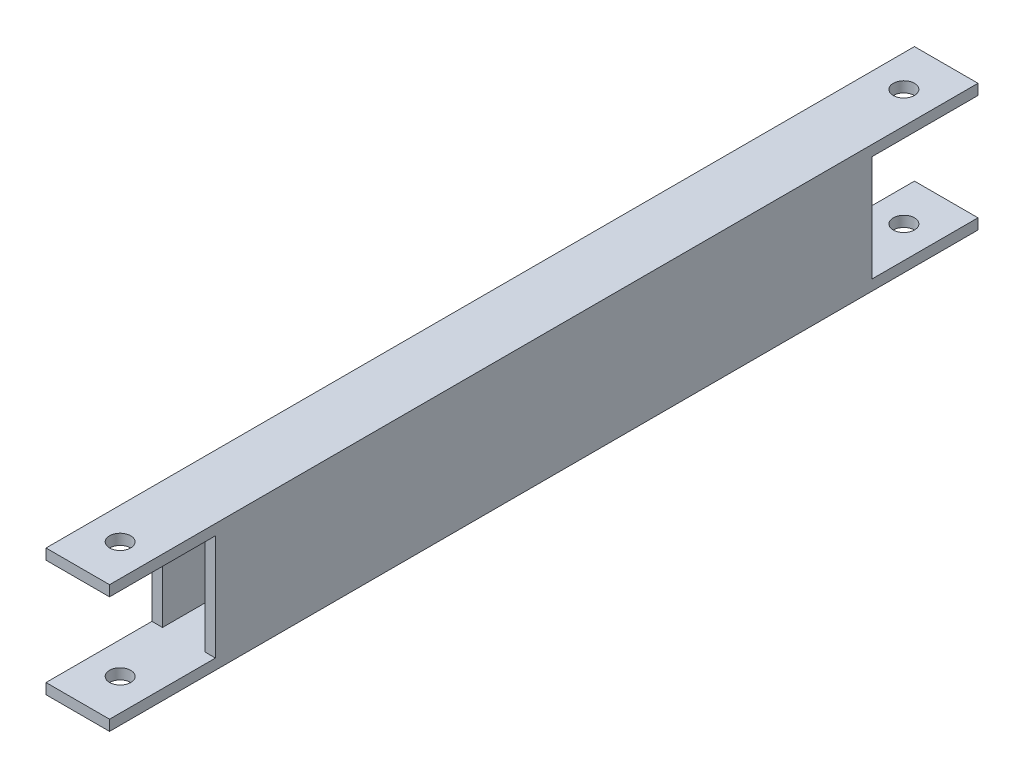
ISO-10303-21;
HEADER;
FILE_DESCRIPTION(('STEP AP214'),'2;1');
FILE_NAME('part.step','',(''),(''),'','','');
FILE_SCHEMA(('AUTOMOTIVE_DESIGN { 1 0 10303 214 1 1 1 1 }'));
ENDSEC;
DATA;
#1=APPLICATION_CONTEXT('core data for automotive mechanical design processes');
#2=APPLICATION_PROTOCOL_DEFINITION('international standard','automotive_design',2000,#1);
#3=PRODUCT_CONTEXT('',#1,'mechanical');
#4=PRODUCT('Part','Part','',(#3));
#5=PRODUCT_RELATED_PRODUCT_CATEGORY('part','',(#4));
#6=PRODUCT_DEFINITION_FORMATION('','',#4);
#7=PRODUCT_DEFINITION_CONTEXT('part definition',#1,'design');
#8=PRODUCT_DEFINITION('design','',#6,#7);
#9=PRODUCT_DEFINITION_SHAPE('','',#8);
#10=(LENGTH_UNIT() NAMED_UNIT(*) SI_UNIT(.MILLI.,.METRE.));
#11=(NAMED_UNIT(*) PLANE_ANGLE_UNIT() SI_UNIT($,.RADIAN.));
#12=(NAMED_UNIT(*) SI_UNIT($,.STERADIAN.) SOLID_ANGLE_UNIT());
#13=UNCERTAINTY_MEASURE_WITH_UNIT(LENGTH_MEASURE(1.E-05),#10,'distance_accuracy_value','');
#14=(GEOMETRIC_REPRESENTATION_CONTEXT(3) GLOBAL_UNCERTAINTY_ASSIGNED_CONTEXT((#13)) GLOBAL_UNIT_ASSIGNED_CONTEXT((#10,
#11,#12)) REPRESENTATION_CONTEXT('',''));
#15=CARTESIAN_POINT('',(0.,0.,0.));
#16=DIRECTION('',(0.,0.,1.));
#17=DIRECTION('',(1.,0.,0.));
#18=AXIS2_PLACEMENT_3D('',#15,#16,#17);
#19=CARTESIAN_POINT('',(15.875,3.175,260.35));
#20=DIRECTION('',(-1.,0.,0.));
#21=DIRECTION('',(0.,0.,1.));
#22=AXIS2_PLACEMENT_3D('',#19,#20,#21);
#23=PLANE('',#22);
#24=DIRECTION('',(0.,0.,-1.));
#25=VECTOR('',#24,1.);
#26=CARTESIAN_POINT('',(15.875,34.925,260.35));
#27=LINE('',#26,#25);
#28=CARTESIAN_POINT('',(15.875,34.925,228.6));
#29=VERTEX_POINT('',#28);
#30=CARTESIAN_POINT('',(15.875,34.925,31.75));
#31=VERTEX_POINT('',#30);
#32=EDGE_CURVE('E267',#29,#31,#27,.T.);
#33=ORIENTED_EDGE('',*,*,#32,.T.);
#34=DIRECTION('',(0.,-1.,0.));
#35=VECTOR('',#34,1.);
#36=CARTESIAN_POINT('',(15.875,3.175,31.75));
#37=LINE('',#36,#35);
#38=CARTESIAN_POINT('',(15.875,3.175,31.75));
#39=VERTEX_POINT('',#38);
#40=EDGE_CURVE('E202',#31,#39,#37,.T.);
#41=ORIENTED_EDGE('',*,*,#40,.T.);
#42=DIRECTION('',(0.,0.,-1.));
#43=VECTOR('',#42,1.);
#44=CARTESIAN_POINT('',(15.875,3.175,260.35));
#45=LINE('',#44,#43);
#46=CARTESIAN_POINT('',(15.875,3.175,228.6));
#47=VERTEX_POINT('',#46);
#48=EDGE_CURVE('E271',#47,#39,#45,.T.);
#49=ORIENTED_EDGE('',*,*,#48,.F.);
#50=DIRECTION('',(0.,1.,0.));
#51=VECTOR('',#50,1.);
#52=CARTESIAN_POINT('',(15.875,3.175,228.6));
#53=LINE('',#52,#51);
#54=EDGE_CURVE('E237',#47,#29,#53,.T.);
#55=ORIENTED_EDGE('',*,*,#54,.T.);
#56=EDGE_LOOP('',(#33,#41,#49,#55));
#57=FACE_BOUND('',#56,.T.);
#58=ADVANCED_FACE('F38',(#57),#23,.T.);
#59=CARTESIAN_POINT('',(3.175,3.175,260.35));
#60=DIRECTION('',(1.,0.,0.));
#61=DIRECTION('',(0.,0.,-1.));
#62=AXIS2_PLACEMENT_3D('',#59,#60,#61);
#63=PLANE('',#62);
#64=DIRECTION('',(0.,0.,-1.));
#65=VECTOR('',#64,1.);
#66=CARTESIAN_POINT('',(3.175,3.175,260.35));
#67=LINE('',#66,#65);
#68=CARTESIAN_POINT('',(3.175,3.175,228.6));
#69=VERTEX_POINT('',#68);
#70=CARTESIAN_POINT('',(3.175,3.175,31.75));
#71=VERTEX_POINT('',#70);
#72=EDGE_CURVE('E259',#69,#71,#67,.T.);
#73=ORIENTED_EDGE('',*,*,#72,.T.);
#74=DIRECTION('',(0.,1.,0.));
#75=VECTOR('',#74,1.);
#76=CARTESIAN_POINT('',(3.175,3.175,31.75));
#77=LINE('',#76,#75);
#78=CARTESIAN_POINT('',(3.175,34.925,31.75));
#79=VERTEX_POINT('',#78);
#80=EDGE_CURVE('E200',#71,#79,#77,.T.);
#81=ORIENTED_EDGE('',*,*,#80,.T.);
#82=DIRECTION('',(0.,0.,-1.));
#83=VECTOR('',#82,1.);
#84=CARTESIAN_POINT('',(3.175,34.925,260.35));
#85=LINE('',#84,#83);
#86=CARTESIAN_POINT('',(3.175,34.925,228.6));
#87=VERTEX_POINT('',#86);
#88=EDGE_CURVE('E177',#87,#79,#85,.T.);
#89=ORIENTED_EDGE('',*,*,#88,.F.);
#90=DIRECTION('',(0.,-1.,0.));
#91=VECTOR('',#90,1.);
#92=CARTESIAN_POINT('',(3.175,3.175,228.6));
#93=LINE('',#92,#91);
#94=EDGE_CURVE('E11',#87,#69,#93,.T.);
#95=ORIENTED_EDGE('',*,*,#94,.T.);
#96=EDGE_LOOP('',(#73,#81,#89,#95));
#97=FACE_BOUND('',#96,.T.);
#98=ADVANCED_FACE('F336',(#97),#63,.T.);
#99=CARTESIAN_POINT('',(0.,0.,0.));
#100=DIRECTION('',(0.,0.,-1.));
#101=DIRECTION('',(-1.,0.,0.));
#102=AXIS2_PLACEMENT_3D('',#99,#100,#101);
#103=PLANE('',#102);
#104=DIRECTION('',(0.,-1.,0.));
#105=VECTOR('',#104,1.);
#106=CARTESIAN_POINT('',(0.,0.,0.));
#107=LINE('',#106,#105);
#108=CARTESIAN_POINT('',(0.,3.175,0.));
#109=VERTEX_POINT('',#108);
#110=CARTESIAN_POINT('',(0.,0.,0.));
#111=VERTEX_POINT('',#110);
#112=EDGE_CURVE('E275',#109,#111,#107,.T.);
#113=ORIENTED_EDGE('',*,*,#112,.F.);
#114=DIRECTION('',(1.,0.,0.));
#115=VECTOR('',#114,1.);
#116=CARTESIAN_POINT('',(3.175,3.175,0.));
#117=LINE('',#116,#115);
#118=CARTESIAN_POINT('',(19.05,3.175,0.));
#119=VERTEX_POINT('',#118);
#120=EDGE_CURVE('E252',#109,#119,#117,.T.);
#121=ORIENTED_EDGE('',*,*,#120,.T.);
#122=DIRECTION('',(0.,1.,0.));
#123=VECTOR('',#122,1.);
#124=CARTESIAN_POINT('',(19.05,0.,0.));
#125=LINE('',#124,#123);
#126=CARTESIAN_POINT('',(19.05,0.,0.));
#127=VERTEX_POINT('',#126);
#128=EDGE_CURVE('E295',#127,#119,#125,.T.);
#129=ORIENTED_EDGE('',*,*,#128,.F.);
#130=DIRECTION('',(1.,0.,0.));
#131=VECTOR('',#130,1.);
#132=CARTESIAN_POINT('',(0.,0.,0.));
#133=LINE('',#132,#131);
#134=EDGE_CURVE('E292',#111,#127,#133,.T.);
#135=ORIENTED_EDGE('',*,*,#134,.F.);
#136=EDGE_LOOP('',(#113,#121,#129,#135));
#137=FACE_BOUND('',#136,.T.);
#138=ADVANCED_FACE('F341',(#137),#103,.T.);
#139=CARTESIAN_POINT('',(19.05,34.925,0.));
#140=VERTEX_POINT('',#139);
#141=CARTESIAN_POINT('',(19.05,38.1,0.));
#142=VERTEX_POINT('',#141);
#143=EDGE_CURVE('E294',#140,#142,#125,.T.);
#144=ORIENTED_EDGE('',*,*,#143,.F.);
#145=DIRECTION('',(-1.,0.,0.));
#146=VECTOR('',#145,1.);
#147=CARTESIAN_POINT('',(3.175,34.925,0.));
#148=LINE('',#147,#146);
#149=CARTESIAN_POINT('',(0.,34.925,0.));
#150=VERTEX_POINT('',#149);
#151=EDGE_CURVE('E257',#140,#150,#148,.T.);
#152=ORIENTED_EDGE('',*,*,#151,.T.);
#153=CARTESIAN_POINT('',(0.,38.1,0.));
#154=VERTEX_POINT('',#153);
#155=EDGE_CURVE('E190',#154,#150,#107,.T.);
#156=ORIENTED_EDGE('',*,*,#155,.F.);
#157=DIRECTION('',(-1.,0.,0.));
#158=VECTOR('',#157,1.);
#159=CARTESIAN_POINT('',(0.,38.1,0.));
#160=LINE('',#159,#158);
#161=EDGE_CURVE('E298',#142,#154,#160,.T.);
#162=ORIENTED_EDGE('',*,*,#161,.F.);
#163=EDGE_LOOP('',(#144,#152,#156,#162));
#164=FACE_BOUND('',#163,.T.);
#165=ADVANCED_FACE('F352',(#164),#103,.T.);
#166=CARTESIAN_POINT('',(0.,0.,260.35));
#167=DIRECTION('',(1.,0.,0.));
#168=DIRECTION('',(0.,0.,-1.));
#169=AXIS2_PLACEMENT_3D('',#166,#167,#168);
#170=PLANE('',#169);
#171=DIRECTION('',(0.,0.,-1.));
#172=VECTOR('',#171,1.);
#173=CARTESIAN_POINT('',(0.,3.175,31.75));
#174=LINE('',#173,#172);
#175=CARTESIAN_POINT('',(0.,3.175,31.75));
#176=VERTEX_POINT('',#175);
#177=EDGE_CURVE('E56',#176,#109,#174,.T.);
#178=ORIENTED_EDGE('',*,*,#177,.T.);
#179=ORIENTED_EDGE('',*,*,#112,.T.);
#180=DIRECTION('',(0.,0.,-1.));
#181=VECTOR('',#180,1.);
#182=CARTESIAN_POINT('',(0.,0.,260.35));
#183=LINE('',#182,#181);
#184=CARTESIAN_POINT('',(0.,0.,260.35));
#185=VERTEX_POINT('',#184);
#186=EDGE_CURVE('E48',#185,#111,#183,.T.);
#187=ORIENTED_EDGE('',*,*,#186,.F.);
#188=DIRECTION('',(0.,-1.,0.));
#189=VECTOR('',#188,1.);
#190=CARTESIAN_POINT('',(0.,0.,260.35));
#191=LINE('',#190,#189);
#192=CARTESIAN_POINT('',(0.,3.175,260.35));
#193=VERTEX_POINT('',#192);
#194=EDGE_CURVE('E280',#193,#185,#191,.T.);
#195=ORIENTED_EDGE('',*,*,#194,.F.);
#196=DIRECTION('',(0.,0.,1.));
#197=VECTOR('',#196,1.);
#198=CARTESIAN_POINT('',(0.,3.175,228.6));
#199=LINE('',#198,#197);
#200=CARTESIAN_POINT('',(0.,3.175,228.6));
#201=VERTEX_POINT('',#200);
#202=EDGE_CURVE('E232',#201,#193,#199,.T.);
#203=ORIENTED_EDGE('',*,*,#202,.F.);
#204=DIRECTION('',(0.,-1.,0.));
#205=VECTOR('',#204,1.);
#206=CARTESIAN_POINT('',(0.,34.925,228.6));
#207=LINE('',#206,#205);
#208=CARTESIAN_POINT('',(0.,34.925,228.6));
#209=VERTEX_POINT('',#208);
#210=EDGE_CURVE('E217',#209,#201,#207,.T.);
#211=ORIENTED_EDGE('',*,*,#210,.F.);
#212=DIRECTION('',(0.,0.,1.));
#213=VECTOR('',#212,1.);
#214=CARTESIAN_POINT('',(0.,34.925,228.6));
#215=LINE('',#214,#213);
#216=CARTESIAN_POINT('',(0.,34.925,260.35));
#217=VERTEX_POINT('',#216);
#218=EDGE_CURVE('E233',#209,#217,#215,.T.);
#219=ORIENTED_EDGE('',*,*,#218,.T.);
#220=CARTESIAN_POINT('',(0.,38.1,260.35));
#221=VERTEX_POINT('',#220);
#222=EDGE_CURVE('E276',#221,#217,#191,.T.);
#223=ORIENTED_EDGE('',*,*,#222,.F.);
#224=DIRECTION('',(0.,0.,-1.));
#225=VECTOR('',#224,1.);
#226=CARTESIAN_POINT('',(0.,38.1,260.35));
#227=LINE('',#226,#225);
#228=EDGE_CURVE('E290',#221,#154,#227,.T.);
#229=ORIENTED_EDGE('',*,*,#228,.T.);
#230=ORIENTED_EDGE('',*,*,#155,.T.);
#231=DIRECTION('',(0.,0.,-1.));
#232=VECTOR('',#231,1.);
#233=CARTESIAN_POINT('',(0.,34.925,31.75));
#234=LINE('',#233,#232);
#235=CARTESIAN_POINT('',(0.,34.925,31.75));
#236=VERTEX_POINT('',#235);
#237=EDGE_CURVE('E173',#236,#150,#234,.T.);
#238=ORIENTED_EDGE('',*,*,#237,.F.);
#239=DIRECTION('',(0.,-1.,0.));
#240=VECTOR('',#239,1.);
#241=CARTESIAN_POINT('',(0.,34.925,31.75));
#242=LINE('',#241,#240);
#243=EDGE_CURVE('E180',#236,#176,#242,.T.);
#244=ORIENTED_EDGE('',*,*,#243,.T.);
#245=EDGE_LOOP('',(#178,#179,#187,#195,#203,#211,#219,#223,#229,#230,#238,#244));
#246=FACE_BOUND('',#245,.T.);
#247=ADVANCED_FACE('F40',(#246),#170,.F.);
#248=CARTESIAN_POINT('',(19.05,0.,260.35));
#249=DIRECTION('',(-1.,0.,0.));
#250=DIRECTION('',(0.,0.,1.));
#251=AXIS2_PLACEMENT_3D('',#248,#249,#250);
#252=PLANE('',#251);
#253=DIRECTION('',(0.,0.,-1.));
#254=VECTOR('',#253,1.);
#255=CARTESIAN_POINT('',(19.05,3.175,31.75));
#256=LINE('',#255,#254);
#257=CARTESIAN_POINT('',(19.05,3.175,31.75));
#258=VERTEX_POINT('',#257);
#259=EDGE_CURVE('E194',#258,#119,#256,.T.);
#260=ORIENTED_EDGE('',*,*,#259,.F.);
#261=DIRECTION('',(0.,1.,0.));
#262=VECTOR('',#261,1.);
#263=CARTESIAN_POINT('',(19.05,34.925,31.75));
#264=LINE('',#263,#262);
#265=CARTESIAN_POINT('',(19.05,34.925,31.75));
#266=VERTEX_POINT('',#265);
#267=EDGE_CURVE('E383',#258,#266,#264,.T.);
#268=ORIENTED_EDGE('',*,*,#267,.T.);
#269=DIRECTION('',(0.,0.,-1.));
#270=VECTOR('',#269,1.);
#271=CARTESIAN_POINT('',(19.05,34.925,31.75));
#272=LINE('',#271,#270);
#273=EDGE_CURVE('E191',#266,#140,#272,.T.);
#274=ORIENTED_EDGE('',*,*,#273,.T.);
#275=ORIENTED_EDGE('',*,*,#143,.T.);
#276=DIRECTION('',(0.,0.,-1.));
#277=VECTOR('',#276,1.);
#278=CARTESIAN_POINT('',(19.05,38.1,260.35));
#279=LINE('',#278,#277);
#280=CARTESIAN_POINT('',(19.05,38.1,260.35));
#281=VERTEX_POINT('',#280);
#282=EDGE_CURVE('E302',#281,#142,#279,.T.);
#283=ORIENTED_EDGE('',*,*,#282,.F.);
#284=DIRECTION('',(0.,1.,0.));
#285=VECTOR('',#284,1.);
#286=CARTESIAN_POINT('',(19.05,0.,260.35));
#287=LINE('',#286,#285);
#288=CARTESIAN_POINT('',(19.05,34.925,260.35));
#289=VERTEX_POINT('',#288);
#290=EDGE_CURVE('E283',#289,#281,#287,.T.);
#291=ORIENTED_EDGE('',*,*,#290,.F.);
#292=DIRECTION('',(0.,0.,1.));
#293=VECTOR('',#292,1.);
#294=CARTESIAN_POINT('',(19.05,34.925,228.6));
#295=LINE('',#294,#293);
#296=CARTESIAN_POINT('',(19.05,34.925,228.6));
#297=VERTEX_POINT('',#296);
#298=EDGE_CURVE('E238',#297,#289,#295,.T.);
#299=ORIENTED_EDGE('',*,*,#298,.F.);
#300=DIRECTION('',(0.,1.,0.));
#301=VECTOR('',#300,1.);
#302=CARTESIAN_POINT('',(19.05,34.925,228.6));
#303=LINE('',#302,#301);
#304=CARTESIAN_POINT('',(19.05,3.175,228.6));
#305=VERTEX_POINT('',#304);
#306=EDGE_CURVE('E225',#305,#297,#303,.T.);
#307=ORIENTED_EDGE('',*,*,#306,.F.);
#308=DIRECTION('',(0.,0.,1.));
#309=VECTOR('',#308,1.);
#310=CARTESIAN_POINT('',(19.05,3.175,228.6));
#311=LINE('',#310,#309);
#312=CARTESIAN_POINT('',(19.05,3.175,260.35));
#313=VERTEX_POINT('',#312);
#314=EDGE_CURVE('E242',#305,#313,#311,.T.);
#315=ORIENTED_EDGE('',*,*,#314,.T.);
#316=CARTESIAN_POINT('',(19.05,0.,260.35));
#317=VERTEX_POINT('',#316);
#318=EDGE_CURVE('E284',#317,#313,#287,.T.);
#319=ORIENTED_EDGE('',*,*,#318,.F.);
#320=DIRECTION('',(0.,0.,-1.));
#321=VECTOR('',#320,1.);
#322=CARTESIAN_POINT('',(19.05,0.,260.35));
#323=LINE('',#322,#321);
#324=EDGE_CURVE('E306',#317,#127,#323,.T.);
#325=ORIENTED_EDGE('',*,*,#324,.T.);
#326=ORIENTED_EDGE('',*,*,#128,.T.);
#327=EDGE_LOOP('',(#260,#268,#274,#275,#283,#291,#299,#307,#315,#319,#325,#326));
#328=FACE_BOUND('',#327,.T.);
#329=ADVANCED_FACE('F357',(#328),#252,.F.);
#330=CARTESIAN_POINT('',(0.,0.,260.35));
#331=DIRECTION('',(0.,0.,-1.));
#332=DIRECTION('',(-1.,0.,0.));
#333=AXIS2_PLACEMENT_3D('',#330,#331,#332);
#334=PLANE('',#333);
#335=ORIENTED_EDGE('',*,*,#222,.T.);
#336=DIRECTION('',(-1.,0.,0.));
#337=VECTOR('',#336,1.);
#338=CARTESIAN_POINT('',(3.175,34.925,260.35));
#339=LINE('',#338,#337);
#340=EDGE_CURVE('E256',#289,#217,#339,.T.);
#341=ORIENTED_EDGE('',*,*,#340,.F.);
#342=ORIENTED_EDGE('',*,*,#290,.T.);
#343=DIRECTION('',(-1.,0.,0.));
#344=VECTOR('',#343,1.);
#345=CARTESIAN_POINT('',(0.,38.1,260.35));
#346=LINE('',#345,#344);
#347=EDGE_CURVE('E288',#281,#221,#346,.T.);
#348=ORIENTED_EDGE('',*,*,#347,.T.);
#349=EDGE_LOOP('',(#335,#341,#342,#348));
#350=FACE_BOUND('',#349,.T.);
#351=ADVANCED_FACE('F348',(#350),#334,.F.);
#352=ORIENTED_EDGE('',*,*,#318,.T.);
#353=DIRECTION('',(1.,0.,0.));
#354=VECTOR('',#353,1.);
#355=CARTESIAN_POINT('',(3.175,3.175,260.35));
#356=LINE('',#355,#354);
#357=EDGE_CURVE('E253',#193,#313,#356,.T.);
#358=ORIENTED_EDGE('',*,*,#357,.F.);
#359=ORIENTED_EDGE('',*,*,#194,.T.);
#360=DIRECTION('',(1.,0.,0.));
#361=VECTOR('',#360,1.);
#362=CARTESIAN_POINT('',(0.,0.,260.35));
#363=LINE('',#362,#361);
#364=EDGE_CURVE('E279',#185,#317,#363,.T.);
#365=ORIENTED_EDGE('',*,*,#364,.T.);
#366=EDGE_LOOP('',(#352,#358,#359,#365));
#367=FACE_BOUND('',#366,.T.);
#368=ADVANCED_FACE('F344',(#367),#334,.F.);
#369=CARTESIAN_POINT('',(0.,0.,260.35));
#370=DIRECTION('',(0.,1.,0.));
#371=DIRECTION('',(0.,0.,1.));
#372=AXIS2_PLACEMENT_3D('',#369,#370,#371);
#373=PLANE('',#372);
#374=CARTESIAN_POINT('',(9.52499999999997,0.,12.7));
#375=DIRECTION('',(0.,-1.,0.));
#376=DIRECTION('',(-1.,0.,0.));
#377=AXIS2_PLACEMENT_3D('',#374,#375,#376);
#378=CIRCLE('',#377,3.175);
#379=CARTESIAN_POINT('',(6.34999999999997,0.,12.7));
#380=VERTEX_POINT('',#379);
#381=EDGE_CURVE('E367',#380,#380,#378,.T.);
#382=ORIENTED_EDGE('',*,*,#381,.F.);
#383=EDGE_LOOP('',(#382));
#384=FACE_BOUND('',#383,.T.);
#385=CARTESIAN_POINT('',(9.52499999999997,0.,247.65));
#386=DIRECTION('',(0.,1.,0.));
#387=DIRECTION('',(-1.,0.,0.));
#388=AXIS2_PLACEMENT_3D('',#385,#386,#387);
#389=CIRCLE('',#388,3.175);
#390=CARTESIAN_POINT('',(6.34999999999997,0.,247.65));
#391=VERTEX_POINT('',#390);
#392=EDGE_CURVE('E206',#391,#391,#389,.T.);
#393=ORIENTED_EDGE('',*,*,#392,.T.);
#394=EDGE_LOOP('',(#393));
#395=FACE_BOUND('',#394,.T.);
#396=ORIENTED_EDGE('',*,*,#134,.T.);
#397=ORIENTED_EDGE('',*,*,#324,.F.);
#398=ORIENTED_EDGE('',*,*,#364,.F.);
#399=ORIENTED_EDGE('',*,*,#186,.T.);
#400=EDGE_LOOP('',(#396,#397,#398,#399));
#401=FACE_BOUND('',#400,.T.);
#402=ADVANCED_FACE('F347',(#384,#395,#401),#373,.F.);
#403=CARTESIAN_POINT('',(0.,38.1,260.35));
#404=DIRECTION('',(0.,-1.,0.));
#405=DIRECTION('',(1.,0.,0.));
#406=AXIS2_PLACEMENT_3D('',#403,#404,#405);
#407=PLANE('',#406);
#408=CARTESIAN_POINT('',(9.525,38.1,12.7));
#409=DIRECTION('',(0.,-1.,0.));
#410=DIRECTION('',(-1.,0.,0.));
#411=AXIS2_PLACEMENT_3D('',#408,#409,#410);
#412=CIRCLE('',#411,3.175);
#413=CARTESIAN_POINT('',(6.35,38.1,12.7));
#414=VERTEX_POINT('',#413);
#415=EDGE_CURVE('E387',#414,#414,#412,.T.);
#416=ORIENTED_EDGE('',*,*,#415,.T.);
#417=EDGE_LOOP('',(#416));
#418=FACE_BOUND('',#417,.T.);
#419=CARTESIAN_POINT('',(9.525,38.1,247.65));
#420=DIRECTION('',(0.,1.,0.));
#421=DIRECTION('',(-1.,0.,0.));
#422=AXIS2_PLACEMENT_3D('',#419,#420,#421);
#423=CIRCLE('',#422,3.175);
#424=CARTESIAN_POINT('',(6.35,38.1,247.65));
#425=VERTEX_POINT('',#424);
#426=EDGE_CURVE('E205',#425,#425,#423,.T.);
#427=ORIENTED_EDGE('',*,*,#426,.F.);
#428=EDGE_LOOP('',(#427));
#429=FACE_BOUND('',#428,.T.);
#430=ORIENTED_EDGE('',*,*,#161,.T.);
#431=ORIENTED_EDGE('',*,*,#228,.F.);
#432=ORIENTED_EDGE('',*,*,#347,.F.);
#433=ORIENTED_EDGE('',*,*,#282,.T.);
#434=EDGE_LOOP('',(#430,#431,#432,#433));
#435=FACE_BOUND('',#434,.T.);
#436=ADVANCED_FACE('F329',(#418,#429,#435),#407,.F.);
#437=CARTESIAN_POINT('',(3.175,3.175,260.35));
#438=DIRECTION('',(0.,1.,0.));
#439=DIRECTION('',(0.,0.,1.));
#440=AXIS2_PLACEMENT_3D('',#437,#438,#439);
#441=PLANE('',#440);
#442=CARTESIAN_POINT('',(9.52499999999997,3.175,12.7));
#443=DIRECTION('',(0.,1.,0.));
#444=DIRECTION('',(0.,0.,1.));
#445=AXIS2_PLACEMENT_3D('',#442,#443,#444);
#446=CIRCLE('',#445,3.175);
#447=CARTESIAN_POINT('',(9.52499999999997,3.175,15.875));
#448=VERTEX_POINT('',#447);
#449=EDGE_CURVE('E186',#448,#448,#446,.F.);
#450=ORIENTED_EDGE('',*,*,#449,.T.);
#451=EDGE_LOOP('',(#450));
#452=FACE_BOUND('',#451,.T.);
#453=ORIENTED_EDGE('',*,*,#120,.F.);
#454=ORIENTED_EDGE('',*,*,#177,.F.);
#455=DIRECTION('',(1.,0.,0.));
#456=VECTOR('',#455,1.);
#457=CARTESIAN_POINT('',(0.,3.175,31.75));
#458=LINE('',#457,#456);
#459=EDGE_CURVE('E184',#176,#71,#458,.T.);
#460=ORIENTED_EDGE('',*,*,#459,.T.);
#461=ORIENTED_EDGE('',*,*,#72,.F.);
#462=DIRECTION('',(1.,0.,0.));
#463=VECTOR('',#462,1.);
#464=CARTESIAN_POINT('',(0.,3.175,228.6));
#465=LINE('',#464,#463);
#466=EDGE_CURVE('E222',#201,#69,#465,.T.);
#467=ORIENTED_EDGE('',*,*,#466,.F.);
#468=ORIENTED_EDGE('',*,*,#202,.T.);
#469=ORIENTED_EDGE('',*,*,#357,.T.);
#470=ORIENTED_EDGE('',*,*,#314,.F.);
#471=EDGE_CURVE('E221',#47,#305,#465,.T.);
#472=ORIENTED_EDGE('',*,*,#471,.F.);
#473=ORIENTED_EDGE('',*,*,#48,.T.);
#474=EDGE_CURVE('E196',#39,#258,#458,.T.);
#475=ORIENTED_EDGE('',*,*,#474,.T.);
#476=ORIENTED_EDGE('',*,*,#259,.T.);
#477=EDGE_LOOP('',(#453,#454,#460,#461,#467,#468,#469,#470,#472,#473,#475,#476));
#478=FACE_BOUND('',#477,.T.);
#479=CARTESIAN_POINT('',(9.52499999999997,3.175,247.65));
#480=DIRECTION('',(0.,1.,0.));
#481=DIRECTION('',(0.,0.,1.));
#482=AXIS2_PLACEMENT_3D('',#479,#480,#481);
#483=CIRCLE('',#482,3.175);
#484=CARTESIAN_POINT('',(6.34999999999997,3.175,247.65));
#485=VERTEX_POINT('',#484);
#486=EDGE_CURVE('E213',#485,#485,#483,.T.);
#487=ORIENTED_EDGE('',*,*,#486,.F.);
#488=EDGE_LOOP('',(#487));
#489=FACE_BOUND('',#488,.T.);
#490=ADVANCED_FACE('F319',(#452,#478,#489),#441,.T.);
#491=CARTESIAN_POINT('',(3.175,34.925,260.35));
#492=DIRECTION('',(0.,-1.,0.));
#493=DIRECTION('',(0.,0.,-1.));
#494=AXIS2_PLACEMENT_3D('',#491,#492,#493);
#495=PLANE('',#494);
#496=CARTESIAN_POINT('',(9.525,34.925,12.7));
#497=DIRECTION('',(0.,-1.,0.));
#498=DIRECTION('',(0.,0.,-1.));
#499=AXIS2_PLACEMENT_3D('',#496,#497,#498);
#500=CIRCLE('',#499,3.175);
#501=CARTESIAN_POINT('',(9.525,34.925,9.52499999999999));
#502=VERTEX_POINT('',#501);
#503=EDGE_CURVE('E42',#502,#502,#500,.F.);
#504=ORIENTED_EDGE('',*,*,#503,.T.);
#505=EDGE_LOOP('',(#504));
#506=FACE_BOUND('',#505,.T.);
#507=ORIENTED_EDGE('',*,*,#151,.F.);
#508=ORIENTED_EDGE('',*,*,#273,.F.);
#509=DIRECTION('',(-1.,0.,0.));
#510=VECTOR('',#509,1.);
#511=CARTESIAN_POINT('',(0.,34.925,31.75));
#512=LINE('',#511,#510);
#513=EDGE_CURVE('E64',#266,#31,#512,.T.);
#514=ORIENTED_EDGE('',*,*,#513,.T.);
#515=ORIENTED_EDGE('',*,*,#32,.F.);
#516=DIRECTION('',(-1.,0.,0.));
#517=VECTOR('',#516,1.);
#518=CARTESIAN_POINT('',(0.,34.925,228.6));
#519=LINE('',#518,#517);
#520=EDGE_CURVE('E229',#297,#29,#519,.T.);
#521=ORIENTED_EDGE('',*,*,#520,.F.);
#522=ORIENTED_EDGE('',*,*,#298,.T.);
#523=ORIENTED_EDGE('',*,*,#340,.T.);
#524=ORIENTED_EDGE('',*,*,#218,.F.);
#525=EDGE_CURVE('E228',#87,#209,#519,.T.);
#526=ORIENTED_EDGE('',*,*,#525,.F.);
#527=ORIENTED_EDGE('',*,*,#88,.T.);
#528=EDGE_CURVE('E168',#79,#236,#512,.T.);
#529=ORIENTED_EDGE('',*,*,#528,.T.);
#530=ORIENTED_EDGE('',*,*,#237,.T.);
#531=EDGE_LOOP('',(#507,#508,#514,#515,#521,#522,#523,#524,#526,#527,#529,#530));
#532=FACE_BOUND('',#531,.T.);
#533=CARTESIAN_POINT('',(9.525,34.925,247.65));
#534=DIRECTION('',(0.,-1.,0.));
#535=DIRECTION('',(0.,0.,-1.));
#536=AXIS2_PLACEMENT_3D('',#533,#534,#535);
#537=CIRCLE('',#536,3.175);
#538=CARTESIAN_POINT('',(6.35,34.925,247.65));
#539=VERTEX_POINT('',#538);
#540=EDGE_CURVE('E210',#539,#539,#537,.T.);
#541=ORIENTED_EDGE('',*,*,#540,.F.);
#542=EDGE_LOOP('',(#541));
#543=FACE_BOUND('',#542,.T.);
#544=ADVANCED_FACE('F170',(#506,#532,#543),#495,.T.);
#545=CARTESIAN_POINT('',(0.,0.,228.6));
#546=DIRECTION('',(0.,0.,1.));
#547=DIRECTION('',(1.,0.,0.));
#548=AXIS2_PLACEMENT_3D('',#545,#546,#547);
#549=PLANE('',#548);
#550=ORIENTED_EDGE('',*,*,#525,.T.);
#551=ORIENTED_EDGE('',*,*,#210,.T.);
#552=ORIENTED_EDGE('',*,*,#466,.T.);
#553=ORIENTED_EDGE('',*,*,#94,.F.);
#554=EDGE_LOOP('',(#550,#551,#552,#553));
#555=FACE_BOUND('',#554,.T.);
#556=ADVANCED_FACE('F318',(#555),#549,.T.);
#557=ORIENTED_EDGE('',*,*,#471,.T.);
#558=ORIENTED_EDGE('',*,*,#306,.T.);
#559=ORIENTED_EDGE('',*,*,#520,.T.);
#560=ORIENTED_EDGE('',*,*,#54,.F.);
#561=EDGE_LOOP('',(#557,#558,#559,#560));
#562=FACE_BOUND('',#561,.T.);
#563=ADVANCED_FACE('F326',(#562),#549,.T.);
#564=CARTESIAN_POINT('',(9.52499999999997,0.,247.65));
#565=DIRECTION('',(0.,1.,0.));
#566=DIRECTION('',(-1.,0.,0.));
#567=AXIS2_PLACEMENT_3D('',#564,#565,#566);
#568=CYLINDRICAL_SURFACE('',#567,3.175);
#569=CARTESIAN_POINT('',(6.35,34.925,247.65));
#570=CARTESIAN_POINT('',(6.35,34.9580729166667,247.65));
#571=CARTESIAN_POINT('',(6.35,34.9911458333333,247.65));
#572=CARTESIAN_POINT('',(6.35,35.0572916666667,247.65));
#573=CARTESIAN_POINT('',(6.35,35.0903645833333,247.65));
#574=CARTESIAN_POINT('',(6.35,35.1565104166667,247.65));
#575=CARTESIAN_POINT('',(6.35,35.1895833333333,247.65));
#576=CARTESIAN_POINT('',(6.35,35.2557291666667,247.65));
#577=CARTESIAN_POINT('',(6.35,35.2888020833333,247.65));
#578=CARTESIAN_POINT('',(6.35,35.3549479166667,247.65));
#579=CARTESIAN_POINT('',(6.35,35.3880208333333,247.65));
#580=CARTESIAN_POINT('',(6.35,35.4541666666667,247.65));
#581=CARTESIAN_POINT('',(6.35,35.4872395833333,247.65));
#582=CARTESIAN_POINT('',(6.35,35.5533854166667,247.65));
#583=CARTESIAN_POINT('',(6.35,35.5864583333333,247.65));
#584=CARTESIAN_POINT('',(6.35,35.6526041666667,247.65));
#585=CARTESIAN_POINT('',(6.35,35.6856770833333,247.65));
#586=CARTESIAN_POINT('',(6.35,35.7518229166667,247.65));
#587=CARTESIAN_POINT('',(6.35,35.7848958333333,247.65));
#588=CARTESIAN_POINT('',(6.35,35.8510416666667,247.65));
#589=CARTESIAN_POINT('',(6.35,35.8841145833333,247.65));
#590=CARTESIAN_POINT('',(6.35,35.9502604166667,247.65));
#591=CARTESIAN_POINT('',(6.35,35.9833333333333,247.65));
#592=CARTESIAN_POINT('',(6.35,36.0494791666667,247.65));
#593=CARTESIAN_POINT('',(6.35,36.0825520833333,247.65));
#594=CARTESIAN_POINT('',(6.35,36.1486979166667,247.65));
#595=CARTESIAN_POINT('',(6.35,36.1817708333333,247.65));
#596=CARTESIAN_POINT('',(6.35,36.2479166666667,247.65));
#597=CARTESIAN_POINT('',(6.35,36.2809895833333,247.65));
#598=CARTESIAN_POINT('',(6.35,36.3471354166667,247.65));
#599=CARTESIAN_POINT('',(6.35,36.3802083333333,247.65));
#600=CARTESIAN_POINT('',(6.35,36.4463541666667,247.65));
#601=CARTESIAN_POINT('',(6.35,36.4794270833333,247.65));
#602=CARTESIAN_POINT('',(6.35,36.5455729166667,247.65));
#603=CARTESIAN_POINT('',(6.35,36.5786458333333,247.65));
#604=CARTESIAN_POINT('',(6.35,36.6447916666667,247.65));
#605=CARTESIAN_POINT('',(6.35,36.6778645833333,247.65));
#606=CARTESIAN_POINT('',(6.35,36.7440104166667,247.65));
#607=CARTESIAN_POINT('',(6.35,36.7770833333333,247.65));
#608=CARTESIAN_POINT('',(6.35,36.8432291666667,247.65));
#609=CARTESIAN_POINT('',(6.35,36.8763020833333,247.65));
#610=CARTESIAN_POINT('',(6.35,36.9424479166667,247.65));
#611=CARTESIAN_POINT('',(6.35,36.9755208333333,247.65));
#612=CARTESIAN_POINT('',(6.35,37.0416666666667,247.65));
#613=CARTESIAN_POINT('',(6.35,37.0747395833333,247.65));
#614=CARTESIAN_POINT('',(6.35,37.1408854166667,247.65));
#615=CARTESIAN_POINT('',(6.35,37.1739583333333,247.65));
#616=CARTESIAN_POINT('',(6.35,37.2401041666667,247.65));
#617=CARTESIAN_POINT('',(6.35,37.2731770833333,247.65));
#618=CARTESIAN_POINT('',(6.35,37.3393229166667,247.65));
#619=CARTESIAN_POINT('',(6.35,37.3723958333333,247.65));
#620=CARTESIAN_POINT('',(6.35,37.4385416666667,247.65));
#621=CARTESIAN_POINT('',(6.35,37.4716145833333,247.65));
#622=CARTESIAN_POINT('',(6.35,37.5377604166667,247.65));
#623=CARTESIAN_POINT('',(6.35,37.5708333333333,247.65));
#624=CARTESIAN_POINT('',(6.35,37.6369791666667,247.65));
#625=CARTESIAN_POINT('',(6.35,37.6700520833333,247.65));
#626=CARTESIAN_POINT('',(6.35,37.7361979166667,247.65));
#627=CARTESIAN_POINT('',(6.35,37.7692708333333,247.65));
#628=CARTESIAN_POINT('',(6.35,37.8354166666667,247.65));
#629=CARTESIAN_POINT('',(6.35,37.8684895833333,247.65));
#630=CARTESIAN_POINT('',(6.35,37.9346354166667,247.65));
#631=CARTESIAN_POINT('',(6.35,37.9677083333333,247.65));
#632=CARTESIAN_POINT('',(6.35,38.0338541666667,247.65));
#633=CARTESIAN_POINT('',(6.35,38.0669270833333,247.65));
#634=CARTESIAN_POINT('',(6.35,38.1,247.65));
#635=B_SPLINE_CURVE_WITH_KNOTS('',3,(#569,#570,#571,#572,#573,#574,#575,#576,#577,#578,#579,
#580,#581,#582,#583,#584,#585,#586,#587,#588,#589,#590,#591,#592,#593,#594,#595,#596,#597,#598,
#599,#600,#601,#602,#603,#604,#605,#606,#607,#608,#609,#610,#611,#612,#613,#614,#615,#616,#617,
#618,#619,#620,#621,#622,#623,#624,#625,#626,#627,#628,#629,#630,#631,#632,#633,#634),
.UNSPECIFIED.,.F.,.F.,(4,2,2,2,2,2,2,2,2,2,2,2,2,2,2,2,2,2,2,2,2,2,2,2,2,2,2,2,2,2,2,2,4),(0.,
0.0992187499999977,0.198437499999995,0.29765625,0.396874999999998,0.496093749999996,0.5953125,
0.694531249999998,0.793749999999996,0.892968749999994,0.992187499999991,1.09140625,
1.19062499999999,1.28984374999999,1.3890625,1.48828124999999,1.58749999999999,1.68671874999999,
1.78593749999999,1.88515624999999,1.98437499999999,2.08359374999999,2.18281249999999,
2.28203124999999,2.38124999999999,2.48046874999999,2.57968749999998,2.67890624999999,
2.77812499999999,2.87734374999998,2.97656249999999,3.07578124999999,3.17499999999998),.UNSPECIFIED.);
#636=EDGE_CURVE('BSEAM315',#539,#425,#635,.T.);
#637=ORIENTED_EDGE('',*,*,#540,.T.);
#638=ORIENTED_EDGE('',*,*,#426,.T.);
#639=ORIENTED_EDGE('',*,*,#636,.T.);
#640=ORIENTED_EDGE('',*,*,#636,.F.);
#641=EDGE_LOOP('',(#637,#639,#638,#640));
#642=FACE_BOUND('',#641,.T.);
#643=ADVANCED_FACE('F315',(#642),#568,.F.);
#644=CARTESIAN_POINT('',(6.34999999999997,3.175,247.65));
#645=CARTESIAN_POINT('',(6.34999999999997,3.14192708333333,247.65));
#646=CARTESIAN_POINT('',(6.34999999999997,3.10885416666667,247.65));
#647=CARTESIAN_POINT('',(6.34999999999997,3.04270833333333,247.65));
#648=CARTESIAN_POINT('',(6.34999999999997,3.00963541666667,247.65));
#649=CARTESIAN_POINT('',(6.34999999999997,2.94348958333333,247.65));
#650=CARTESIAN_POINT('',(6.34999999999997,2.91041666666667,247.65));
#651=CARTESIAN_POINT('',(6.34999999999997,2.84427083333333,247.65));
#652=CARTESIAN_POINT('',(6.34999999999997,2.81119791666667,247.65));
#653=CARTESIAN_POINT('',(6.34999999999997,2.74505208333333,247.65));
#654=CARTESIAN_POINT('',(6.34999999999997,2.71197916666667,247.65));
#655=CARTESIAN_POINT('',(6.34999999999997,2.64583333333333,247.65));
#656=CARTESIAN_POINT('',(6.34999999999997,2.61276041666667,247.65));
#657=CARTESIAN_POINT('',(6.34999999999997,2.54661458333333,247.65));
#658=CARTESIAN_POINT('',(6.34999999999997,2.51354166666667,247.65));
#659=CARTESIAN_POINT('',(6.34999999999997,2.44739583333333,247.65));
#660=CARTESIAN_POINT('',(6.34999999999997,2.41432291666667,247.65));
#661=CARTESIAN_POINT('',(6.34999999999997,2.34817708333333,247.65));
#662=CARTESIAN_POINT('',(6.34999999999997,2.31510416666667,247.65));
#663=CARTESIAN_POINT('',(6.34999999999997,2.24895833333333,247.65));
#664=CARTESIAN_POINT('',(6.34999999999997,2.21588541666666,247.65));
#665=CARTESIAN_POINT('',(6.34999999999997,2.14973958333333,247.65));
#666=CARTESIAN_POINT('',(6.34999999999997,2.11666666666666,247.65));
#667=CARTESIAN_POINT('',(6.34999999999997,2.05052083333333,247.65));
#668=CARTESIAN_POINT('',(6.34999999999997,2.01744791666667,247.65));
#669=CARTESIAN_POINT('',(6.34999999999997,1.95130208333333,247.65));
#670=CARTESIAN_POINT('',(6.34999999999997,1.91822916666666,247.65));
#671=CARTESIAN_POINT('',(6.34999999999997,1.85208333333333,247.65));
#672=CARTESIAN_POINT('',(6.34999999999997,1.81901041666666,247.65));
#673=CARTESIAN_POINT('',(6.34999999999997,1.75286458333333,247.65));
#674=CARTESIAN_POINT('',(6.34999999999997,1.71979166666666,247.65));
#675=CARTESIAN_POINT('',(6.34999999999997,1.65364583333333,247.65));
#676=CARTESIAN_POINT('',(6.34999999999997,1.62057291666666,247.65));
#677=CARTESIAN_POINT('',(6.34999999999997,1.55442708333333,247.65));
#678=CARTESIAN_POINT('',(6.34999999999997,1.52135416666666,247.65));
#679=CARTESIAN_POINT('',(6.34999999999997,1.45520833333333,247.65));
#680=CARTESIAN_POINT('',(6.34999999999997,1.42213541666666,247.65));
#681=CARTESIAN_POINT('',(6.34999999999997,1.35598958333333,247.65));
#682=CARTESIAN_POINT('',(6.34999999999997,1.32291666666666,247.65));
#683=CARTESIAN_POINT('',(6.34999999999997,1.25677083333333,247.65));
#684=CARTESIAN_POINT('',(6.34999999999997,1.22369791666666,247.65));
#685=CARTESIAN_POINT('',(6.34999999999997,1.15755208333333,247.65));
#686=CARTESIAN_POINT('',(6.34999999999997,1.12447916666666,247.65));
#687=CARTESIAN_POINT('',(6.34999999999997,1.05833333333333,247.65));
#688=CARTESIAN_POINT('',(6.34999999999997,1.02526041666666,247.65));
#689=CARTESIAN_POINT('',(6.34999999999997,0.95911458333333,247.65));
#690=CARTESIAN_POINT('',(6.34999999999997,0.926041666666663,247.65));
#691=CARTESIAN_POINT('',(6.34999999999997,0.85989583333333,247.65));
#692=CARTESIAN_POINT('',(6.34999999999997,0.826822916666663,247.65));
#693=CARTESIAN_POINT('',(6.34999999999997,0.76067708333333,247.65));
#694=CARTESIAN_POINT('',(6.34999999999997,0.727604166666663,247.65));
#695=CARTESIAN_POINT('',(6.34999999999997,0.66145833333333,247.65));
#696=CARTESIAN_POINT('',(6.34999999999997,0.628385416666663,247.65));
#697=CARTESIAN_POINT('',(6.34999999999997,0.562239583333329,247.65));
#698=CARTESIAN_POINT('',(6.34999999999997,0.529166666666663,247.65));
#699=CARTESIAN_POINT('',(6.34999999999997,0.463020833333329,247.65));
#700=CARTESIAN_POINT('',(6.34999999999997,0.429947916666663,247.65));
#701=CARTESIAN_POINT('',(6.34999999999997,0.363802083333329,247.65));
#702=CARTESIAN_POINT('',(6.34999999999997,0.330729166666663,247.65));
#703=CARTESIAN_POINT('',(6.34999999999997,0.264583333333329,247.65));
#704=CARTESIAN_POINT('',(6.34999999999997,0.231510416666662,247.65));
#705=CARTESIAN_POINT('',(6.34999999999997,0.165364583333329,247.65));
#706=CARTESIAN_POINT('',(6.34999999999997,0.132291666666662,247.65));
#707=CARTESIAN_POINT('',(6.34999999999997,0.0661458333333289,247.65));
#708=CARTESIAN_POINT('',(6.34999999999997,0.0330729166666622,247.65));
#709=CARTESIAN_POINT('',(6.34999999999997,0.,247.65));
#710=B_SPLINE_CURVE_WITH_KNOTS('',3,(#644,#645,#646,#647,#648,#649,#650,#651,#652,#653,#654,
#655,#656,#657,#658,#659,#660,#661,#662,#663,#664,#665,#666,#667,#668,#669,#670,#671,#672,#673,
#674,#675,#676,#677,#678,#679,#680,#681,#682,#683,#684,#685,#686,#687,#688,#689,#690,#691,#692,
#693,#694,#695,#696,#697,#698,#699,#700,#701,#702,#703,#704,#705,#706,#707,#708,#709),
.UNSPECIFIED.,.F.,.F.,(4,2,2,2,2,2,2,2,2,2,2,2,2,2,2,2,2,2,2,2,2,2,2,2,2,2,2,2,2,2,2,2,4),(0.,
0.0992187500000004,0.1984375,0.297656250000001,0.396875000000001,0.496093750000001,
0.595312500000001,0.694531250000001,0.793750000000001,0.892968750000001,0.992187500000002,
1.09140625,1.190625,1.28984375,1.3890625,1.48828125,1.5875,1.68671875,1.7859375,1.88515625,
1.984375,2.08359375,2.1828125,2.28203125,2.38125,2.48046875,2.5796875,2.67890625,2.778125,
2.87734375,2.9765625,3.07578125,3.175),.UNSPECIFIED.);
#711=EDGE_CURVE('BSEAM432',#485,#391,#710,.T.);
#712=ORIENTED_EDGE('',*,*,#486,.T.);
#713=ORIENTED_EDGE('',*,*,#392,.F.);
#714=ORIENTED_EDGE('',*,*,#711,.T.);
#715=ORIENTED_EDGE('',*,*,#711,.F.);
#716=EDGE_LOOP('',(#712,#714,#713,#715));
#717=FACE_BOUND('',#716,.T.);
#718=ADVANCED_FACE('F432',(#717),#568,.F.);
#719=CARTESIAN_POINT('',(0.,0.,31.75));
#720=DIRECTION('',(0.,0.,-1.));
#721=DIRECTION('',(1.,0.,0.));
#722=AXIS2_PLACEMENT_3D('',#719,#720,#721);
#723=PLANE('',#722);
#724=ORIENTED_EDGE('',*,*,#513,.F.);
#725=ORIENTED_EDGE('',*,*,#267,.F.);
#726=ORIENTED_EDGE('',*,*,#474,.F.);
#727=ORIENTED_EDGE('',*,*,#40,.F.);
#728=EDGE_LOOP('',(#724,#725,#726,#727));
#729=FACE_BOUND('',#728,.T.);
#730=ADVANCED_FACE('F409',(#729),#723,.T.);
#731=ORIENTED_EDGE('',*,*,#459,.F.);
#732=ORIENTED_EDGE('',*,*,#243,.F.);
#733=ORIENTED_EDGE('',*,*,#528,.F.);
#734=ORIENTED_EDGE('',*,*,#80,.F.);
#735=EDGE_LOOP('',(#731,#732,#733,#734));
#736=FACE_BOUND('',#735,.T.);
#737=ADVANCED_FACE('F183',(#736),#723,.T.);
#738=CARTESIAN_POINT('',(9.52499999999997,0.,12.7));
#739=DIRECTION('',(0.,1.,0.));
#740=DIRECTION('',(-1.,0.,0.));
#741=AXIS2_PLACEMENT_3D('',#738,#739,#740);
#742=CYLINDRICAL_SURFACE('',#741,3.175);
#743=ORIENTED_EDGE('',*,*,#503,.F.);
#744=EDGE_LOOP('',(#743));
#745=FACE_BOUND('',#744,.T.);
#746=ORIENTED_EDGE('',*,*,#415,.F.);
#747=EDGE_LOOP('',(#746));
#748=FACE_BOUND('',#747,.T.);
#749=ADVANCED_FACE('F393',(#745,#748),#742,.F.);
#750=ORIENTED_EDGE('',*,*,#449,.F.);
#751=EDGE_LOOP('',(#750));
#752=FACE_BOUND('',#751,.T.);
#753=ORIENTED_EDGE('',*,*,#381,.T.);
#754=EDGE_LOOP('',(#753));
#755=FACE_BOUND('',#754,.T.);
#756=ADVANCED_FACE('F396',(#752,#755),#742,.F.);
#757=CLOSED_SHELL('',(#58,#98,#138,#165,#247,#329,#351,#368,#402,#436,#490,#544,#556,#563,#643,
#718,#730,#737,#749,#756));
#758=MANIFOLD_SOLID_BREP('B2',#757);
#759=ADVANCED_BREP_SHAPE_REPRESENTATION('',(#18,#758),#14);
#760=SHAPE_DEFINITION_REPRESENTATION(#9,#759);
ENDSEC;
END-ISO-10303-21;
